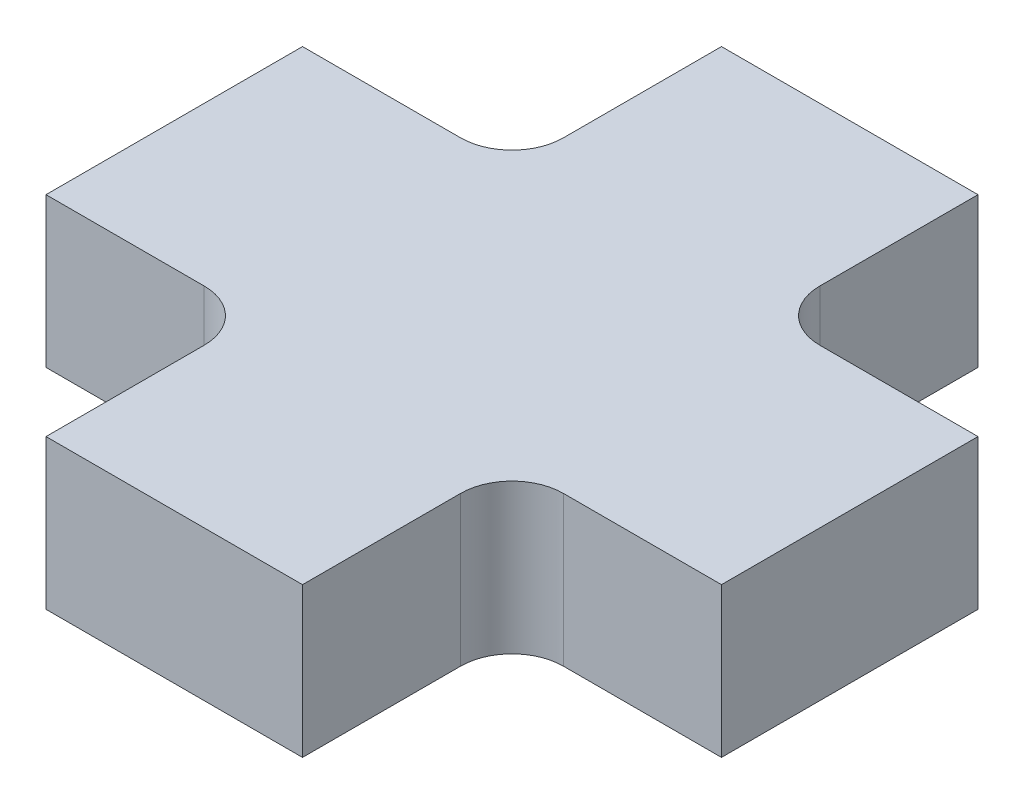
ISO-10303-21;
HEADER;
FILE_DESCRIPTION(('STEP AP214'),'2;1');
FILE_NAME('part.step','',(''),(''),'','','');
FILE_SCHEMA(('AUTOMOTIVE_DESIGN { 1 0 10303 214 1 1 1 1 }'));
ENDSEC;
DATA;
#1=APPLICATION_CONTEXT('core data for automotive mechanical design processes');
#2=APPLICATION_PROTOCOL_DEFINITION('international standard','automotive_design',2000,#1);
#3=PRODUCT_CONTEXT('',#1,'mechanical');
#4=PRODUCT('Part','Part','',(#3));
#5=PRODUCT_RELATED_PRODUCT_CATEGORY('part','',(#4));
#6=PRODUCT_DEFINITION_FORMATION('','',#4);
#7=PRODUCT_DEFINITION_CONTEXT('part definition',#1,'design');
#8=PRODUCT_DEFINITION('design','',#6,#7);
#9=PRODUCT_DEFINITION_SHAPE('','',#8);
#10=(LENGTH_UNIT() NAMED_UNIT(*) SI_UNIT(.MILLI.,.METRE.));
#11=(NAMED_UNIT(*) PLANE_ANGLE_UNIT() SI_UNIT($,.RADIAN.));
#12=(NAMED_UNIT(*) SI_UNIT($,.STERADIAN.) SOLID_ANGLE_UNIT());
#13=UNCERTAINTY_MEASURE_WITH_UNIT(LENGTH_MEASURE(1.E-05),#10,'distance_accuracy_value','');
#14=(GEOMETRIC_REPRESENTATION_CONTEXT(3) GLOBAL_UNCERTAINTY_ASSIGNED_CONTEXT((#13)) GLOBAL_UNIT_ASSIGNED_CONTEXT((#10,
#11,#12)) REPRESENTATION_CONTEXT('',''));
#15=CARTESIAN_POINT('',(0.,0.,0.));
#16=DIRECTION('',(0.,0.,1.));
#17=DIRECTION('',(1.,0.,0.));
#18=AXIS2_PLACEMENT_3D('',#15,#16,#17);
#19=CARTESIAN_POINT('',(0.,4.445,0.));
#20=DIRECTION('',(0.,0.,1.));
#21=DIRECTION('',(1.,0.,0.));
#22=AXIS2_PLACEMENT_3D('',#19,#20,#21);
#23=PLANE('',#22);
#24=DIRECTION('',(-1.,0.,0.));
#25=VECTOR('',#24,1.);
#26=CARTESIAN_POINT('',(0.,0.,0.));
#27=LINE('',#26,#25);
#28=CARTESIAN_POINT('',(4.699,0.,0.));
#29=VERTEX_POINT('',#28);
#30=CARTESIAN_POINT('',(0.,0.,0.));
#31=VERTEX_POINT('',#30);
#32=EDGE_CURVE('E202',#29,#31,#27,.T.);
#33=ORIENTED_EDGE('',*,*,#32,.F.);
#34=DIRECTION('',(0.,-1.,0.));
#35=VECTOR('',#34,1.);
#36=CARTESIAN_POINT('',(4.699,4.445,0.));
#37=LINE('',#36,#35);
#38=CARTESIAN_POINT('',(4.699,4.445,0.));
#39=VERTEX_POINT('',#38);
#40=EDGE_CURVE('E256',#29,#39,#37,.F.);
#41=ORIENTED_EDGE('',*,*,#40,.T.);
#42=DIRECTION('',(-1.,0.,0.));
#43=VECTOR('',#42,1.);
#44=CARTESIAN_POINT('',(0.,4.445,0.));
#45=LINE('',#44,#43);
#46=CARTESIAN_POINT('',(0.,4.445,0.));
#47=VERTEX_POINT('',#46);
#48=EDGE_CURVE('E169',#39,#47,#45,.T.);
#49=ORIENTED_EDGE('',*,*,#48,.T.);
#50=DIRECTION('',(0.,-1.,0.));
#51=VECTOR('',#50,1.);
#52=CARTESIAN_POINT('',(0.,4.445,0.));
#53=LINE('',#52,#51);
#54=EDGE_CURVE('E201',#47,#31,#53,.T.);
#55=ORIENTED_EDGE('',*,*,#54,.T.);
#56=EDGE_LOOP('',(#33,#41,#49,#55));
#57=FACE_BOUND('',#56,.T.);
#58=ADVANCED_FACE('F35',(#57),#23,.T.);
#59=CARTESIAN_POINT('',(6.223,4.445,0.));
#60=DIRECTION('',(-1.,0.,0.));
#61=DIRECTION('',(0.,0.,1.));
#62=AXIS2_PLACEMENT_3D('',#59,#60,#61);
#63=PLANE('',#62);
#64=DIRECTION('',(0.,0.,-1.));
#65=VECTOR('',#64,1.);
#66=CARTESIAN_POINT('',(6.223,4.445,0.));
#67=LINE('',#66,#65);
#68=CARTESIAN_POINT('',(6.223,4.445,6.223));
#69=VERTEX_POINT('',#68);
#70=CARTESIAN_POINT('',(6.223,4.445,1.524));
#71=VERTEX_POINT('',#70);
#72=EDGE_CURVE('E150',#69,#71,#67,.T.);
#73=ORIENTED_EDGE('',*,*,#72,.T.);
#74=DIRECTION('',(0.,-1.,0.));
#75=VECTOR('',#74,1.);
#76=CARTESIAN_POINT('',(6.223,0.,1.524));
#77=LINE('',#76,#75);
#78=CARTESIAN_POINT('',(6.223,0.,1.524));
#79=VERTEX_POINT('',#78);
#80=EDGE_CURVE('E254',#71,#79,#77,.T.);
#81=ORIENTED_EDGE('',*,*,#80,.T.);
#82=DIRECTION('',(0.,0.,-1.));
#83=VECTOR('',#82,1.);
#84=CARTESIAN_POINT('',(6.223,0.,0.));
#85=LINE('',#84,#83);
#86=CARTESIAN_POINT('',(6.223,0.,6.223));
#87=VERTEX_POINT('',#86);
#88=EDGE_CURVE('E153',#87,#79,#85,.T.);
#89=ORIENTED_EDGE('',*,*,#88,.F.);
#90=DIRECTION('',(0.,-1.,0.));
#91=VECTOR('',#90,1.);
#92=CARTESIAN_POINT('',(6.223,4.445,6.223));
#93=LINE('',#92,#91);
#94=EDGE_CURVE('E146',#69,#87,#93,.T.);
#95=ORIENTED_EDGE('',*,*,#94,.F.);
#96=EDGE_LOOP('',(#73,#81,#89,#95));
#97=FACE_BOUND('',#96,.T.);
#98=ADVANCED_FACE('F148',(#97),#63,.T.);
#99=CARTESIAN_POINT('',(0.,4.445,6.223));
#100=DIRECTION('',(0.,0.,1.));
#101=DIRECTION('',(1.,0.,0.));
#102=AXIS2_PLACEMENT_3D('',#99,#100,#101);
#103=PLANE('',#102);
#104=DIRECTION('',(-1.,0.,0.));
#105=VECTOR('',#104,1.);
#106=CARTESIAN_POINT('',(0.,0.,6.223));
#107=LINE('',#106,#105);
#108=CARTESIAN_POINT('',(13.843,0.,6.223));
#109=VERTEX_POINT('',#108);
#110=EDGE_CURVE('E205',#109,#87,#107,.T.);
#111=ORIENTED_EDGE('',*,*,#110,.F.);
#112=DIRECTION('',(0.,-1.,0.));
#113=VECTOR('',#112,1.);
#114=CARTESIAN_POINT('',(13.843,4.445,6.223));
#115=LINE('',#114,#113);
#116=CARTESIAN_POINT('',(13.843,4.445,6.223));
#117=VERTEX_POINT('',#116);
#118=EDGE_CURVE('E159',#117,#109,#115,.T.);
#119=ORIENTED_EDGE('',*,*,#118,.F.);
#120=DIRECTION('',(-1.,0.,0.));
#121=VECTOR('',#120,1.);
#122=CARTESIAN_POINT('',(0.,4.445,6.223));
#123=LINE('',#122,#121);
#124=EDGE_CURVE('E166',#117,#69,#123,.T.);
#125=ORIENTED_EDGE('',*,*,#124,.T.);
#126=ORIENTED_EDGE('',*,*,#94,.T.);
#127=EDGE_LOOP('',(#111,#119,#125,#126));
#128=FACE_BOUND('',#127,.T.);
#129=ADVANCED_FACE('F172',(#128),#103,.T.);
#130=CARTESIAN_POINT('',(13.843,4.445,0.));
#131=DIRECTION('',(1.,0.,0.));
#132=DIRECTION('',(0.,0.,-1.));
#133=AXIS2_PLACEMENT_3D('',#130,#131,#132);
#134=PLANE('',#133);
#135=DIRECTION('',(0.,0.,1.));
#136=VECTOR('',#135,1.);
#137=CARTESIAN_POINT('',(13.843,0.,0.));
#138=LINE('',#137,#136);
#139=CARTESIAN_POINT('',(13.843,0.,1.524));
#140=VERTEX_POINT('',#139);
#141=EDGE_CURVE('E207',#140,#109,#138,.T.);
#142=ORIENTED_EDGE('',*,*,#141,.F.);
#143=DIRECTION('',(0.,-1.,0.));
#144=VECTOR('',#143,1.);
#145=CARTESIAN_POINT('',(13.843,4.445,1.524));
#146=LINE('',#145,#144);
#147=CARTESIAN_POINT('',(13.843,4.445,1.524));
#148=VERTEX_POINT('',#147);
#149=EDGE_CURVE('E252',#140,#148,#146,.F.);
#150=ORIENTED_EDGE('',*,*,#149,.T.);
#151=DIRECTION('',(0.,0.,1.));
#152=VECTOR('',#151,1.);
#153=CARTESIAN_POINT('',(13.843,4.445,0.));
#154=LINE('',#153,#152);
#155=EDGE_CURVE('E174',#148,#117,#154,.T.);
#156=ORIENTED_EDGE('',*,*,#155,.T.);
#157=ORIENTED_EDGE('',*,*,#118,.T.);
#158=EDGE_LOOP('',(#142,#150,#156,#157));
#159=FACE_BOUND('',#158,.T.);
#160=ADVANCED_FACE('F354',(#159),#134,.T.);
#161=CARTESIAN_POINT('',(0.,4.445,0.));
#162=DIRECTION('',(0.,0.,1.));
#163=DIRECTION('',(1.,0.,0.));
#164=AXIS2_PLACEMENT_3D('',#161,#162,#163);
#165=PLANE('',#164);
#166=DIRECTION('',(-1.,0.,0.));
#167=VECTOR('',#166,1.);
#168=CARTESIAN_POINT('',(0.,4.445,0.));
#169=LINE('',#168,#167);
#170=CARTESIAN_POINT('',(20.066,4.445,0.));
#171=VERTEX_POINT('',#170);
#172=CARTESIAN_POINT('',(15.367,4.445,0.));
#173=VERTEX_POINT('',#172);
#174=EDGE_CURVE('E176',#171,#173,#169,.T.);
#175=ORIENTED_EDGE('',*,*,#174,.T.);
#176=DIRECTION('',(0.,-1.,0.));
#177=VECTOR('',#176,1.);
#178=CARTESIAN_POINT('',(15.367,0.,0.));
#179=LINE('',#178,#177);
#180=CARTESIAN_POINT('',(15.367,0.,0.));
#181=VERTEX_POINT('',#180);
#182=EDGE_CURVE('E249',#173,#181,#179,.T.);
#183=ORIENTED_EDGE('',*,*,#182,.T.);
#184=DIRECTION('',(-1.,0.,0.));
#185=VECTOR('',#184,1.);
#186=CARTESIAN_POINT('',(0.,0.,0.));
#187=LINE('',#186,#185);
#188=CARTESIAN_POINT('',(20.066,0.,0.));
#189=VERTEX_POINT('',#188);
#190=EDGE_CURVE('E209',#189,#181,#187,.T.);
#191=ORIENTED_EDGE('',*,*,#190,.F.);
#192=DIRECTION('',(0.,-1.,0.));
#193=VECTOR('',#192,1.);
#194=CARTESIAN_POINT('',(20.066,4.445,0.));
#195=LINE('',#194,#193);
#196=EDGE_CURVE('E242',#171,#189,#195,.T.);
#197=ORIENTED_EDGE('',*,*,#196,.F.);
#198=EDGE_LOOP('',(#175,#183,#191,#197));
#199=FACE_BOUND('',#198,.T.);
#200=ADVANCED_FACE('F350',(#199),#165,.T.);
#201=CARTESIAN_POINT('',(20.066,4.445,0.));
#202=DIRECTION('',(1.,0.,0.));
#203=DIRECTION('',(0.,0.,-1.));
#204=AXIS2_PLACEMENT_3D('',#201,#202,#203);
#205=PLANE('',#204);
#206=DIRECTION('',(0.,0.,1.));
#207=VECTOR('',#206,1.);
#208=CARTESIAN_POINT('',(20.066,0.,0.));
#209=LINE('',#208,#207);
#210=CARTESIAN_POINT('',(20.066,0.,-7.62));
#211=VERTEX_POINT('',#210);
#212=EDGE_CURVE('E212',#211,#189,#209,.T.);
#213=ORIENTED_EDGE('',*,*,#212,.F.);
#214=DIRECTION('',(0.,-1.,0.));
#215=VECTOR('',#214,1.);
#216=CARTESIAN_POINT('',(20.066,4.445,-7.62));
#217=LINE('',#216,#215);
#218=CARTESIAN_POINT('',(20.066,4.445,-7.62));
#219=VERTEX_POINT('',#218);
#220=EDGE_CURVE('E239',#219,#211,#217,.T.);
#221=ORIENTED_EDGE('',*,*,#220,.F.);
#222=DIRECTION('',(0.,0.,1.));
#223=VECTOR('',#222,1.);
#224=CARTESIAN_POINT('',(20.066,4.445,0.));
#225=LINE('',#224,#223);
#226=EDGE_CURVE('E182',#219,#171,#225,.T.);
#227=ORIENTED_EDGE('',*,*,#226,.T.);
#228=ORIENTED_EDGE('',*,*,#196,.T.);
#229=EDGE_LOOP('',(#213,#221,#227,#228));
#230=FACE_BOUND('',#229,.T.);
#231=ADVANCED_FACE('F346',(#230),#205,.T.);
#232=CARTESIAN_POINT('',(0.,4.445,-7.62));
#233=DIRECTION('',(0.,0.,-1.));
#234=DIRECTION('',(-1.,0.,0.));
#235=AXIS2_PLACEMENT_3D('',#232,#233,#234);
#236=PLANE('',#235);
#237=DIRECTION('',(1.,0.,0.));
#238=VECTOR('',#237,1.);
#239=CARTESIAN_POINT('',(0.,0.,-7.62));
#240=LINE('',#239,#238);
#241=CARTESIAN_POINT('',(15.367,0.,-7.62));
#242=VERTEX_POINT('',#241);
#243=EDGE_CURVE('E215',#242,#211,#240,.T.);
#244=ORIENTED_EDGE('',*,*,#243,.F.);
#245=DIRECTION('',(0.,-1.,0.));
#246=VECTOR('',#245,1.);
#247=CARTESIAN_POINT('',(15.367,4.445,-7.62));
#248=LINE('',#247,#246);
#249=CARTESIAN_POINT('',(15.367,4.445,-7.62));
#250=VERTEX_POINT('',#249);
#251=EDGE_CURVE('E247',#242,#250,#248,.F.);
#252=ORIENTED_EDGE('',*,*,#251,.T.);
#253=DIRECTION('',(1.,0.,0.));
#254=VECTOR('',#253,1.);
#255=CARTESIAN_POINT('',(0.,4.445,-7.62));
#256=LINE('',#255,#254);
#257=EDGE_CURVE('E185',#250,#219,#256,.T.);
#258=ORIENTED_EDGE('',*,*,#257,.T.);
#259=ORIENTED_EDGE('',*,*,#220,.T.);
#260=EDGE_LOOP('',(#244,#252,#258,#259));
#261=FACE_BOUND('',#260,.T.);
#262=ADVANCED_FACE('F343',(#261),#236,.T.);
#263=CARTESIAN_POINT('',(13.843,4.445,0.));
#264=DIRECTION('',(1.,0.,0.));
#265=DIRECTION('',(0.,0.,-1.));
#266=AXIS2_PLACEMENT_3D('',#263,#264,#265);
#267=PLANE('',#266);
#268=DIRECTION('',(0.,0.,1.));
#269=VECTOR('',#268,1.);
#270=CARTESIAN_POINT('',(13.843,4.445,0.));
#271=LINE('',#270,#269);
#272=CARTESIAN_POINT('',(13.843,4.445,-13.843));
#273=VERTEX_POINT('',#272);
#274=CARTESIAN_POINT('',(13.843,4.445,-9.144));
#275=VERTEX_POINT('',#274);
#276=EDGE_CURVE('E187',#273,#275,#271,.T.);
#277=ORIENTED_EDGE('',*,*,#276,.T.);
#278=DIRECTION('',(0.,-1.,0.));
#279=VECTOR('',#278,1.);
#280=CARTESIAN_POINT('',(13.843,0.,-9.144));
#281=LINE('',#280,#279);
#282=CARTESIAN_POINT('',(13.843,0.,-9.144));
#283=VERTEX_POINT('',#282);
#284=EDGE_CURVE('E158',#275,#283,#281,.T.);
#285=ORIENTED_EDGE('',*,*,#284,.T.);
#286=DIRECTION('',(0.,0.,1.));
#287=VECTOR('',#286,1.);
#288=CARTESIAN_POINT('',(13.843,0.,0.));
#289=LINE('',#288,#287);
#290=CARTESIAN_POINT('',(13.843,0.,-13.843));
#291=VERTEX_POINT('',#290);
#292=EDGE_CURVE('E217',#291,#283,#289,.T.);
#293=ORIENTED_EDGE('',*,*,#292,.F.);
#294=DIRECTION('',(0.,-1.,0.));
#295=VECTOR('',#294,1.);
#296=CARTESIAN_POINT('',(13.843,4.445,-13.843));
#297=LINE('',#296,#295);
#298=EDGE_CURVE('E237',#273,#291,#297,.T.);
#299=ORIENTED_EDGE('',*,*,#298,.F.);
#300=EDGE_LOOP('',(#277,#285,#293,#299));
#301=FACE_BOUND('',#300,.T.);
#302=ADVANCED_FACE('F312',(#301),#267,.T.);
#303=CARTESIAN_POINT('',(0.,4.445,-13.843));
#304=DIRECTION('',(0.,0.,-1.));
#305=DIRECTION('',(-1.,0.,0.));
#306=AXIS2_PLACEMENT_3D('',#303,#304,#305);
#307=PLANE('',#306);
#308=DIRECTION('',(1.,0.,0.));
#309=VECTOR('',#308,1.);
#310=CARTESIAN_POINT('',(0.,0.,-13.843));
#311=LINE('',#310,#309);
#312=CARTESIAN_POINT('',(6.223,0.,-13.843));
#313=VERTEX_POINT('',#312);
#314=EDGE_CURVE('E220',#313,#291,#311,.T.);
#315=ORIENTED_EDGE('',*,*,#314,.F.);
#316=DIRECTION('',(0.,-1.,0.));
#317=VECTOR('',#316,1.);
#318=CARTESIAN_POINT('',(6.223,4.445,-13.843));
#319=LINE('',#318,#317);
#320=CARTESIAN_POINT('',(6.223,4.445,-13.843));
#321=VERTEX_POINT('',#320);
#322=EDGE_CURVE('E234',#321,#313,#319,.T.);
#323=ORIENTED_EDGE('',*,*,#322,.F.);
#324=DIRECTION('',(1.,0.,0.));
#325=VECTOR('',#324,1.);
#326=CARTESIAN_POINT('',(0.,4.445,-13.843));
#327=LINE('',#326,#325);
#328=EDGE_CURVE('E190',#321,#273,#327,.T.);
#329=ORIENTED_EDGE('',*,*,#328,.T.);
#330=ORIENTED_EDGE('',*,*,#298,.T.);
#331=EDGE_LOOP('',(#315,#323,#329,#330));
#332=FACE_BOUND('',#331,.T.);
#333=ADVANCED_FACE('F316',(#332),#307,.T.);
#334=CARTESIAN_POINT('',(6.223,4.445,0.));
#335=DIRECTION('',(-1.,0.,0.));
#336=DIRECTION('',(0.,0.,1.));
#337=AXIS2_PLACEMENT_3D('',#334,#335,#336);
#338=PLANE('',#337);
#339=DIRECTION('',(0.,0.,-1.));
#340=VECTOR('',#339,1.);
#341=CARTESIAN_POINT('',(6.223,0.,0.));
#342=LINE('',#341,#340);
#343=CARTESIAN_POINT('',(6.223,0.,-9.144));
#344=VERTEX_POINT('',#343);
#345=EDGE_CURVE('E223',#344,#313,#342,.T.);
#346=ORIENTED_EDGE('',*,*,#345,.F.);
#347=DIRECTION('',(0.,-1.,0.));
#348=VECTOR('',#347,1.);
#349=CARTESIAN_POINT('',(6.223,4.445,-9.144));
#350=LINE('',#349,#348);
#351=CARTESIAN_POINT('',(6.223,4.445,-9.144));
#352=VERTEX_POINT('',#351);
#353=EDGE_CURVE('E50',#344,#352,#350,.F.);
#354=ORIENTED_EDGE('',*,*,#353,.T.);
#355=DIRECTION('',(0.,0.,-1.));
#356=VECTOR('',#355,1.);
#357=CARTESIAN_POINT('',(6.223,4.445,0.));
#358=LINE('',#357,#356);
#359=EDGE_CURVE('E193',#352,#321,#358,.T.);
#360=ORIENTED_EDGE('',*,*,#359,.T.);
#361=ORIENTED_EDGE('',*,*,#322,.T.);
#362=EDGE_LOOP('',(#346,#354,#360,#361));
#363=FACE_BOUND('',#362,.T.);
#364=ADVANCED_FACE('F334',(#363),#338,.T.);
#365=CARTESIAN_POINT('',(0.,4.445,-7.62));
#366=DIRECTION('',(0.,0.,-1.));
#367=DIRECTION('',(-1.,0.,0.));
#368=AXIS2_PLACEMENT_3D('',#365,#366,#367);
#369=PLANE('',#368);
#370=DIRECTION('',(1.,0.,0.));
#371=VECTOR('',#370,1.);
#372=CARTESIAN_POINT('',(0.,4.445,-7.62));
#373=LINE('',#372,#371);
#374=CARTESIAN_POINT('',(0.,4.445,-7.62));
#375=VERTEX_POINT('',#374);
#376=CARTESIAN_POINT('',(4.699,4.445,-7.62));
#377=VERTEX_POINT('',#376);
#378=EDGE_CURVE('E195',#375,#377,#373,.T.);
#379=ORIENTED_EDGE('',*,*,#378,.T.);
#380=DIRECTION('',(0.,-1.,0.));
#381=VECTOR('',#380,1.);
#382=CARTESIAN_POINT('',(4.699,0.,-7.62));
#383=LINE('',#382,#381);
#384=CARTESIAN_POINT('',(4.699,0.,-7.62));
#385=VERTEX_POINT('',#384);
#386=EDGE_CURVE('E258',#377,#385,#383,.T.);
#387=ORIENTED_EDGE('',*,*,#386,.T.);
#388=DIRECTION('',(1.,0.,0.));
#389=VECTOR('',#388,1.);
#390=CARTESIAN_POINT('',(0.,0.,-7.62));
#391=LINE('',#390,#389);
#392=CARTESIAN_POINT('',(0.,0.,-7.62));
#393=VERTEX_POINT('',#392);
#394=EDGE_CURVE('E225',#393,#385,#391,.T.);
#395=ORIENTED_EDGE('',*,*,#394,.F.);
#396=DIRECTION('',(0.,-1.,0.));
#397=VECTOR('',#396,1.);
#398=CARTESIAN_POINT('',(0.,4.445,-7.62));
#399=LINE('',#398,#397);
#400=EDGE_CURVE('E232',#375,#393,#399,.T.);
#401=ORIENTED_EDGE('',*,*,#400,.F.);
#402=EDGE_LOOP('',(#379,#387,#395,#401));
#403=FACE_BOUND('',#402,.T.);
#404=ADVANCED_FACE('F323',(#403),#369,.T.);
#405=CARTESIAN_POINT('',(0.,4.445,0.));
#406=DIRECTION('',(-1.,0.,0.));
#407=DIRECTION('',(0.,0.,1.));
#408=AXIS2_PLACEMENT_3D('',#405,#406,#407);
#409=PLANE('',#408);
#410=DIRECTION('',(0.,0.,-1.));
#411=VECTOR('',#410,1.);
#412=CARTESIAN_POINT('',(0.,0.,0.));
#413=LINE('',#412,#411);
#414=EDGE_CURVE('E227',#31,#393,#413,.T.);
#415=ORIENTED_EDGE('',*,*,#414,.F.);
#416=ORIENTED_EDGE('',*,*,#54,.F.);
#417=DIRECTION('',(0.,0.,-1.));
#418=VECTOR('',#417,1.);
#419=CARTESIAN_POINT('',(0.,4.445,0.));
#420=LINE('',#419,#418);
#421=EDGE_CURVE('E198',#47,#375,#420,.T.);
#422=ORIENTED_EDGE('',*,*,#421,.T.);
#423=ORIENTED_EDGE('',*,*,#400,.T.);
#424=EDGE_LOOP('',(#415,#416,#422,#423));
#425=FACE_BOUND('',#424,.T.);
#426=ADVANCED_FACE('F325',(#425),#409,.T.);
#427=CARTESIAN_POINT('',(0.,4.445,0.));
#428=DIRECTION('',(0.,1.,0.));
#429=DIRECTION('',(0.,0.,1.));
#430=AXIS2_PLACEMENT_3D('',#427,#428,#429);
#431=PLANE('',#430);
#432=ORIENTED_EDGE('',*,*,#48,.F.);
#433=CARTESIAN_POINT('',(4.699,4.445,1.524));
#434=DIRECTION('',(0.,1.,0.));
#435=DIRECTION('',(0.,0.,1.));
#436=AXIS2_PLACEMENT_3D('',#433,#434,#435);
#437=CIRCLE('',#436,1.524);
#438=EDGE_CURVE('E168',#39,#71,#437,.F.);
#439=ORIENTED_EDGE('',*,*,#438,.T.);
#440=ORIENTED_EDGE('',*,*,#72,.F.);
#441=ORIENTED_EDGE('',*,*,#124,.F.);
#442=ORIENTED_EDGE('',*,*,#155,.F.);
#443=CARTESIAN_POINT('',(15.367,4.445,1.524));
#444=DIRECTION('',(0.,1.,0.));
#445=DIRECTION('',(0.,0.,1.));
#446=AXIS2_PLACEMENT_3D('',#443,#444,#445);
#447=CIRCLE('',#446,1.524);
#448=EDGE_CURVE('E268',#148,#173,#447,.F.);
#449=ORIENTED_EDGE('',*,*,#448,.T.);
#450=ORIENTED_EDGE('',*,*,#174,.F.);
#451=ORIENTED_EDGE('',*,*,#226,.F.);
#452=ORIENTED_EDGE('',*,*,#257,.F.);
#453=CARTESIAN_POINT('',(15.367,4.445,-9.144));
#454=DIRECTION('',(0.,1.,0.));
#455=DIRECTION('',(0.,0.,1.));
#456=AXIS2_PLACEMENT_3D('',#453,#454,#455);
#457=CIRCLE('',#456,1.524);
#458=EDGE_CURVE('E264',#250,#275,#457,.F.);
#459=ORIENTED_EDGE('',*,*,#458,.T.);
#460=ORIENTED_EDGE('',*,*,#276,.F.);
#461=ORIENTED_EDGE('',*,*,#328,.F.);
#462=ORIENTED_EDGE('',*,*,#359,.F.);
#463=CARTESIAN_POINT('',(4.699,4.445,-9.144));
#464=DIRECTION('',(0.,1.,0.));
#465=DIRECTION('',(0.,0.,1.));
#466=AXIS2_PLACEMENT_3D('',#463,#464,#465);
#467=CIRCLE('',#466,1.524);
#468=EDGE_CURVE('E11',#352,#377,#467,.F.);
#469=ORIENTED_EDGE('',*,*,#468,.T.);
#470=ORIENTED_EDGE('',*,*,#378,.F.);
#471=ORIENTED_EDGE('',*,*,#421,.F.);
#472=EDGE_LOOP('',(#432,#439,#440,#441,#442,#449,#450,#451,#452,#459,#460,#461,#462,#469,#470,#471));
#473=FACE_BOUND('',#472,.T.);
#474=ADVANCED_FACE('F164',(#473),#431,.T.);
#475=CARTESIAN_POINT('',(0.,0.,0.));
#476=DIRECTION('',(0.,1.,0.));
#477=DIRECTION('',(0.,0.,1.));
#478=AXIS2_PLACEMENT_3D('',#475,#476,#477);
#479=PLANE('',#478);
#480=ORIENTED_EDGE('',*,*,#88,.T.);
#481=CARTESIAN_POINT('',(4.699,0.,1.524));
#482=DIRECTION('',(0.,1.,0.));
#483=DIRECTION('',(0.,0.,1.));
#484=AXIS2_PLACEMENT_3D('',#481,#482,#483);
#485=CIRCLE('',#484,1.524);
#486=EDGE_CURVE('E270',#79,#29,#485,.T.);
#487=ORIENTED_EDGE('',*,*,#486,.T.);
#488=ORIENTED_EDGE('',*,*,#32,.T.);
#489=ORIENTED_EDGE('',*,*,#414,.T.);
#490=ORIENTED_EDGE('',*,*,#394,.T.);
#491=CARTESIAN_POINT('',(4.699,0.,-9.144));
#492=DIRECTION('',(0.,1.,0.));
#493=DIRECTION('',(0.,0.,1.));
#494=AXIS2_PLACEMENT_3D('',#491,#492,#493);
#495=CIRCLE('',#494,1.524);
#496=EDGE_CURVE('E43',#385,#344,#495,.T.);
#497=ORIENTED_EDGE('',*,*,#496,.T.);
#498=ORIENTED_EDGE('',*,*,#345,.T.);
#499=ORIENTED_EDGE('',*,*,#314,.T.);
#500=ORIENTED_EDGE('',*,*,#292,.T.);
#501=CARTESIAN_POINT('',(15.367,0.,-9.144));
#502=DIRECTION('',(0.,1.,0.));
#503=DIRECTION('',(0.,0.,1.));
#504=AXIS2_PLACEMENT_3D('',#501,#502,#503);
#505=CIRCLE('',#504,1.524);
#506=EDGE_CURVE('E262',#283,#242,#505,.T.);
#507=ORIENTED_EDGE('',*,*,#506,.T.);
#508=ORIENTED_EDGE('',*,*,#243,.T.);
#509=ORIENTED_EDGE('',*,*,#212,.T.);
#510=ORIENTED_EDGE('',*,*,#190,.T.);
#511=CARTESIAN_POINT('',(15.367,0.,1.524));
#512=DIRECTION('',(0.,1.,0.));
#513=DIRECTION('',(0.,0.,1.));
#514=AXIS2_PLACEMENT_3D('',#511,#512,#513);
#515=CIRCLE('',#514,1.524);
#516=EDGE_CURVE('E266',#181,#140,#515,.T.);
#517=ORIENTED_EDGE('',*,*,#516,.T.);
#518=ORIENTED_EDGE('',*,*,#141,.T.);
#519=ORIENTED_EDGE('',*,*,#110,.T.);
#520=EDGE_LOOP('',(#480,#487,#488,#489,#490,#497,#498,#499,#500,#507,#508,#509,#510,#517,#518,#519));
#521=FACE_BOUND('',#520,.T.);
#522=ADVANCED_FACE('F273',(#521),#479,.F.);
#523=CARTESIAN_POINT('',(15.367,4.445,-9.144));
#524=DIRECTION('',(0.,1.,0.));
#525=DIRECTION('',(0.,0.,1.));
#526=AXIS2_PLACEMENT_3D('',#523,#524,#525);
#527=CYLINDRICAL_SURFACE('',#526,1.524);
#528=ORIENTED_EDGE('',*,*,#458,.F.);
#529=ORIENTED_EDGE('',*,*,#251,.F.);
#530=ORIENTED_EDGE('',*,*,#506,.F.);
#531=ORIENTED_EDGE('',*,*,#284,.F.);
#532=EDGE_LOOP('',(#528,#529,#530,#531));
#533=FACE_BOUND('',#532,.T.);
#534=ADVANCED_FACE('F287',(#533),#527,.F.);
#535=CARTESIAN_POINT('',(15.367,4.445,1.524));
#536=DIRECTION('',(0.,1.,0.));
#537=DIRECTION('',(0.,0.,1.));
#538=AXIS2_PLACEMENT_3D('',#535,#536,#537);
#539=CYLINDRICAL_SURFACE('',#538,1.524);
#540=ORIENTED_EDGE('',*,*,#448,.F.);
#541=ORIENTED_EDGE('',*,*,#149,.F.);
#542=ORIENTED_EDGE('',*,*,#516,.F.);
#543=ORIENTED_EDGE('',*,*,#182,.F.);
#544=EDGE_LOOP('',(#540,#541,#542,#543));
#545=FACE_BOUND('',#544,.T.);
#546=ADVANCED_FACE('F281',(#545),#539,.F.);
#547=CARTESIAN_POINT('',(4.699,4.445,1.524));
#548=DIRECTION('',(0.,1.,0.));
#549=DIRECTION('',(0.,0.,1.));
#550=AXIS2_PLACEMENT_3D('',#547,#548,#549);
#551=CYLINDRICAL_SURFACE('',#550,1.524);
#552=ORIENTED_EDGE('',*,*,#438,.F.);
#553=ORIENTED_EDGE('',*,*,#40,.F.);
#554=ORIENTED_EDGE('',*,*,#486,.F.);
#555=ORIENTED_EDGE('',*,*,#80,.F.);
#556=EDGE_LOOP('',(#552,#553,#554,#555));
#557=FACE_BOUND('',#556,.T.);
#558=ADVANCED_FACE('F279',(#557),#551,.F.);
#559=CARTESIAN_POINT('',(4.699,4.445,-9.144));
#560=DIRECTION('',(0.,1.,0.));
#561=DIRECTION('',(0.,0.,1.));
#562=AXIS2_PLACEMENT_3D('',#559,#560,#561);
#563=CYLINDRICAL_SURFACE('',#562,1.524);
#564=ORIENTED_EDGE('',*,*,#468,.F.);
#565=ORIENTED_EDGE('',*,*,#353,.F.);
#566=ORIENTED_EDGE('',*,*,#496,.F.);
#567=ORIENTED_EDGE('',*,*,#386,.F.);
#568=EDGE_LOOP('',(#564,#565,#566,#567));
#569=FACE_BOUND('',#568,.T.);
#570=ADVANCED_FACE('F37',(#569),#563,.F.);
#571=CLOSED_SHELL('',(#58,#98,#129,#160,#200,#231,#262,#302,#333,#364,#404,#426,#474,#522,#534,
#546,#558,#570));
#572=MANIFOLD_SOLID_BREP('B2',#571);
#573=ADVANCED_BREP_SHAPE_REPRESENTATION('',(#18,#572),#14);
#574=SHAPE_DEFINITION_REPRESENTATION(#9,#573);
ENDSEC;
END-ISO-10303-21;
